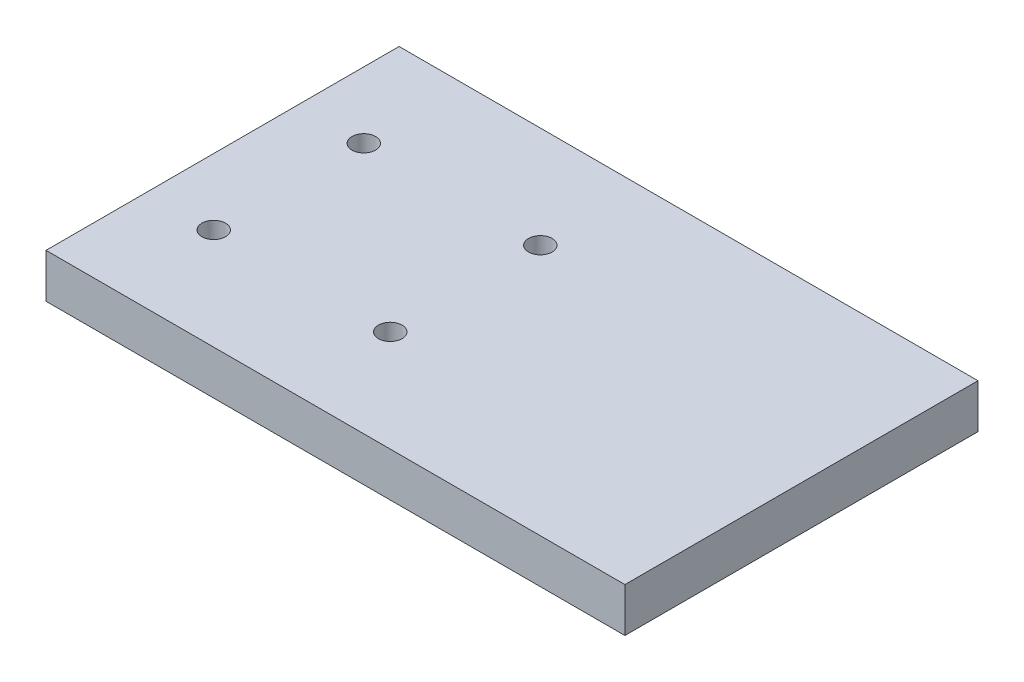
ISO-10303-21;
HEADER;
FILE_DESCRIPTION(('STEP AP214'),'2;1');
FILE_NAME('part.step','',(''),(''),'','','');
FILE_SCHEMA(('AUTOMOTIVE_DESIGN { 1 0 10303 214 1 1 1 1 }'));
ENDSEC;
DATA;
#1=APPLICATION_CONTEXT('core data for automotive mechanical design processes');
#2=APPLICATION_PROTOCOL_DEFINITION('international standard','automotive_design',2000,#1);
#3=PRODUCT_CONTEXT('',#1,'mechanical');
#4=PRODUCT('Part','Part','',(#3));
#5=PRODUCT_RELATED_PRODUCT_CATEGORY('part','',(#4));
#6=PRODUCT_DEFINITION_FORMATION('','',#4);
#7=PRODUCT_DEFINITION_CONTEXT('part definition',#1,'design');
#8=PRODUCT_DEFINITION('design','',#6,#7);
#9=PRODUCT_DEFINITION_SHAPE('','',#8);
#10=(LENGTH_UNIT() NAMED_UNIT(*) SI_UNIT(.MILLI.,.METRE.));
#11=(NAMED_UNIT(*) PLANE_ANGLE_UNIT() SI_UNIT($,.RADIAN.));
#12=(NAMED_UNIT(*) SI_UNIT($,.STERADIAN.) SOLID_ANGLE_UNIT());
#13=UNCERTAINTY_MEASURE_WITH_UNIT(LENGTH_MEASURE(1.E-05),#10,'distance_accuracy_value','');
#14=(GEOMETRIC_REPRESENTATION_CONTEXT(3) GLOBAL_UNCERTAINTY_ASSIGNED_CONTEXT((#13)) GLOBAL_UNIT_ASSIGNED_CONTEXT((#10,
#11,#12)) REPRESENTATION_CONTEXT('',''));
#15=CARTESIAN_POINT('',(0.,0.,0.));
#16=DIRECTION('',(0.,0.,1.));
#17=DIRECTION('',(1.,0.,0.));
#18=AXIS2_PLACEMENT_3D('',#15,#16,#17);
#19=CARTESIAN_POINT('',(0.,6.35,0.));
#20=DIRECTION('',(0.,-1.,0.));
#21=DIRECTION('',(0.,0.,-1.));
#22=AXIS2_PLACEMENT_3D('',#19,#20,#21);
#23=PLANE('',#22);
#24=CARTESIAN_POINT('',(-6.65836450012036,6.35,10.795));
#25=DIRECTION('',(0.,1.,0.));
#26=DIRECTION('',(0.,0.,1.));
#27=AXIS2_PLACEMENT_3D('',#24,#25,#26);
#28=CIRCLE('',#27,1.70053);
#29=CARTESIAN_POINT('',(-6.65836450012036,6.35,12.49553));
#30=VERTEX_POINT('',#29);
#31=EDGE_CURVE('E157',#30,#30,#28,.T.);
#32=ORIENTED_EDGE('',*,*,#31,.F.);
#33=EDGE_LOOP('',(#32));
#34=FACE_BOUND('',#33,.T.);
#35=CARTESIAN_POINT('',(-32.0583645001204,6.35,-10.795));
#36=DIRECTION('',(0.,1.,0.));
#37=DIRECTION('',(0.,0.,1.));
#38=AXIS2_PLACEMENT_3D('',#35,#36,#37);
#39=CIRCLE('',#38,1.70053);
#40=CARTESIAN_POINT('',(-32.0583645001204,6.35,-9.09447000000001));
#41=VERTEX_POINT('',#40);
#42=EDGE_CURVE('E99',#41,#41,#39,.T.);
#43=ORIENTED_EDGE('',*,*,#42,.F.);
#44=EDGE_LOOP('',(#43));
#45=FACE_BOUND('',#44,.T.);
#46=DIRECTION('',(-1.,0.,0.));
#47=VECTOR('',#46,1.);
#48=CARTESIAN_POINT('',(-41.5846345001203,6.35,-25.4));
#49=LINE('',#48,#47);
#50=CARTESIAN_POINT('',(41.7070454998797,6.35,-25.4));
#51=VERTEX_POINT('',#50);
#52=CARTESIAN_POINT('',(-41.5846345001203,6.35,-25.4));
#53=VERTEX_POINT('',#52);
#54=EDGE_CURVE('E50',#51,#53,#49,.T.);
#55=ORIENTED_EDGE('',*,*,#54,.T.);
#56=DIRECTION('',(0.,0.,1.));
#57=VECTOR('',#56,1.);
#58=CARTESIAN_POINT('',(-41.5846345001203,6.35,-25.4));
#59=LINE('',#58,#57);
#60=CARTESIAN_POINT('',(-41.5846345001203,6.35,25.4));
#61=VERTEX_POINT('',#60);
#62=EDGE_CURVE('E81',#53,#61,#59,.T.);
#63=ORIENTED_EDGE('',*,*,#62,.T.);
#64=DIRECTION('',(1.,0.,0.));
#65=VECTOR('',#64,1.);
#66=CARTESIAN_POINT('',(-41.5846345001203,6.35,25.4));
#67=LINE('',#66,#65);
#68=CARTESIAN_POINT('',(41.7070454998797,6.35,25.4));
#69=VERTEX_POINT('',#68);
#70=EDGE_CURVE('E85',#61,#69,#67,.T.);
#71=ORIENTED_EDGE('',*,*,#70,.T.);
#72=DIRECTION('',(0.,0.,-1.));
#73=VECTOR('',#72,1.);
#74=CARTESIAN_POINT('',(41.7070454998797,6.35,-25.4));
#75=LINE('',#74,#73);
#76=EDGE_CURVE('E92',#69,#51,#75,.T.);
#77=ORIENTED_EDGE('',*,*,#76,.T.);
#78=EDGE_LOOP('',(#55,#63,#71,#77));
#79=FACE_BOUND('',#78,.T.);
#80=CARTESIAN_POINT('',(-32.0583645001204,6.35,10.795));
#81=DIRECTION('',(0.,1.,0.));
#82=DIRECTION('',(0.,0.,1.));
#83=AXIS2_PLACEMENT_3D('',#80,#81,#82);
#84=CIRCLE('',#83,1.70053);
#85=CARTESIAN_POINT('',(-32.0583645001204,6.35,12.49553));
#86=VERTEX_POINT('',#85);
#87=EDGE_CURVE('E163',#86,#86,#84,.T.);
#88=ORIENTED_EDGE('',*,*,#87,.F.);
#89=EDGE_LOOP('',(#88));
#90=FACE_BOUND('',#89,.T.);
#91=CARTESIAN_POINT('',(-6.65836450012036,6.35,-10.795));
#92=DIRECTION('',(0.,1.,0.));
#93=DIRECTION('',(0.,0.,1.));
#94=AXIS2_PLACEMENT_3D('',#91,#92,#93);
#95=CIRCLE('',#94,1.70053);
#96=CARTESIAN_POINT('',(-6.65836450012036,6.35,-9.09447000000001));
#97=VERTEX_POINT('',#96);
#98=EDGE_CURVE('E148',#97,#97,#95,.T.);
#99=ORIENTED_EDGE('',*,*,#98,.F.);
#100=EDGE_LOOP('',(#99));
#101=FACE_BOUND('',#100,.T.);
#102=ADVANCED_FACE('F33',(#34,#45,#79,#90,#101),#23,.F.);
#103=CARTESIAN_POINT('',(0.,0.,0.));
#104=DIRECTION('',(0.,-1.,0.));
#105=DIRECTION('',(0.,0.,-1.));
#106=AXIS2_PLACEMENT_3D('',#103,#104,#105);
#107=PLANE('',#106);
#108=CARTESIAN_POINT('',(-6.65836450012036,0.,10.795));
#109=DIRECTION('',(0.,1.,0.));
#110=DIRECTION('',(0.,0.,1.));
#111=AXIS2_PLACEMENT_3D('',#108,#109,#110);
#112=CIRCLE('',#111,1.70053);
#113=CARTESIAN_POINT('',(-6.65836450012036,0.,12.49553));
#114=VERTEX_POINT('',#113);
#115=EDGE_CURVE('E154',#114,#114,#112,.T.);
#116=ORIENTED_EDGE('',*,*,#115,.T.);
#117=EDGE_LOOP('',(#116));
#118=FACE_BOUND('',#117,.T.);
#119=CARTESIAN_POINT('',(-32.0583645001204,0.,-10.795));
#120=DIRECTION('',(0.,1.,0.));
#121=DIRECTION('',(0.,0.,1.));
#122=AXIS2_PLACEMENT_3D('',#119,#120,#121);
#123=CIRCLE('',#122,1.70053);
#124=CARTESIAN_POINT('',(-32.0583645001204,0.,-9.09447000000001));
#125=VERTEX_POINT('',#124);
#126=EDGE_CURVE('E166',#125,#125,#123,.T.);
#127=ORIENTED_EDGE('',*,*,#126,.T.);
#128=EDGE_LOOP('',(#127));
#129=FACE_BOUND('',#128,.T.);
#130=DIRECTION('',(0.,0.,1.));
#131=VECTOR('',#130,1.);
#132=CARTESIAN_POINT('',(-41.5846345001203,0.,-25.4));
#133=LINE('',#132,#131);
#134=CARTESIAN_POINT('',(-41.5846345001203,0.,-25.4));
#135=VERTEX_POINT('',#134);
#136=CARTESIAN_POINT('',(-41.5846345001203,0.,25.4));
#137=VERTEX_POINT('',#136);
#138=EDGE_CURVE('E88',#135,#137,#133,.T.);
#139=ORIENTED_EDGE('',*,*,#138,.F.);
#140=DIRECTION('',(-1.,0.,0.));
#141=VECTOR('',#140,1.);
#142=CARTESIAN_POINT('',(-38.5357973161203,0.,-25.4));
#143=LINE('',#142,#141);
#144=CARTESIAN_POINT('',(41.7070454998797,0.,-25.4));
#145=VERTEX_POINT('',#144);
#146=EDGE_CURVE('E74',#145,#135,#143,.T.);
#147=ORIENTED_EDGE('',*,*,#146,.F.);
#148=DIRECTION('',(0.,0.,-1.));
#149=VECTOR('',#148,1.);
#150=CARTESIAN_POINT('',(41.7070454998797,0.,-25.4));
#151=LINE('',#150,#149);
#152=CARTESIAN_POINT('',(41.7070454998797,0.,25.4));
#153=VERTEX_POINT('',#152);
#154=EDGE_CURVE('E101',#153,#145,#151,.T.);
#155=ORIENTED_EDGE('',*,*,#154,.F.);
#156=DIRECTION('',(1.,0.,0.));
#157=VECTOR('',#156,1.);
#158=CARTESIAN_POINT('',(41.7070454998797,0.,25.4));
#159=LINE('',#158,#157);
#160=EDGE_CURVE('E67',#137,#153,#159,.T.);
#161=ORIENTED_EDGE('',*,*,#160,.F.);
#162=EDGE_LOOP('',(#139,#147,#155,#161));
#163=FACE_BOUND('',#162,.T.);
#164=CARTESIAN_POINT('',(-32.0583645001204,0.,10.795));
#165=DIRECTION('',(0.,1.,0.));
#166=DIRECTION('',(0.,0.,1.));
#167=AXIS2_PLACEMENT_3D('',#164,#165,#166);
#168=CIRCLE('',#167,1.70053);
#169=CARTESIAN_POINT('',(-32.0583645001204,0.,12.49553));
#170=VERTEX_POINT('',#169);
#171=EDGE_CURVE('E160',#170,#170,#168,.T.);
#172=ORIENTED_EDGE('',*,*,#171,.T.);
#173=EDGE_LOOP('',(#172));
#174=FACE_BOUND('',#173,.T.);
#175=CARTESIAN_POINT('',(-6.65836450012036,0.,-10.795));
#176=DIRECTION('',(0.,1.,0.));
#177=DIRECTION('',(0.,0.,1.));
#178=AXIS2_PLACEMENT_3D('',#175,#176,#177);
#179=CIRCLE('',#178,1.70053);
#180=CARTESIAN_POINT('',(-6.65836450012036,0.,-9.09447000000001));
#181=VERTEX_POINT('',#180);
#182=EDGE_CURVE('E151',#181,#181,#179,.T.);
#183=ORIENTED_EDGE('',*,*,#182,.T.);
#184=EDGE_LOOP('',(#183));
#185=FACE_BOUND('',#184,.T.);
#186=ADVANCED_FACE('F108',(#118,#129,#163,#174,#185),#107,.T.);
#187=CARTESIAN_POINT('',(-41.5846345001203,6.35,-25.4));
#188=DIRECTION('',(1.,0.,0.));
#189=DIRECTION('',(0.,0.,-1.));
#190=AXIS2_PLACEMENT_3D('',#187,#188,#189);
#191=PLANE('',#190);
#192=ORIENTED_EDGE('',*,*,#138,.T.);
#193=DIRECTION('',(0.,-1.,0.));
#194=VECTOR('',#193,1.);
#195=CARTESIAN_POINT('',(-41.5846345001203,6.35,25.4));
#196=LINE('',#195,#194);
#197=EDGE_CURVE('E42',#61,#137,#196,.T.);
#198=ORIENTED_EDGE('',*,*,#197,.F.);
#199=ORIENTED_EDGE('',*,*,#62,.F.);
#200=DIRECTION('',(0.,-1.,0.));
#201=VECTOR('',#200,1.);
#202=CARTESIAN_POINT('',(-41.5846345001203,6.35,-25.4));
#203=LINE('',#202,#201);
#204=EDGE_CURVE('E11',#53,#135,#203,.T.);
#205=ORIENTED_EDGE('',*,*,#204,.T.);
#206=EDGE_LOOP('',(#192,#198,#199,#205));
#207=FACE_BOUND('',#206,.T.);
#208=ADVANCED_FACE('F35',(#207),#191,.F.);
#209=CARTESIAN_POINT('',(41.7070454998797,6.35,25.4));
#210=DIRECTION('',(0.,0.,-1.));
#211=DIRECTION('',(-1.,0.,0.));
#212=AXIS2_PLACEMENT_3D('',#209,#210,#211);
#213=PLANE('',#212);
#214=ORIENTED_EDGE('',*,*,#160,.T.);
#215=DIRECTION('',(0.,-1.,0.));
#216=VECTOR('',#215,1.);
#217=CARTESIAN_POINT('',(41.7070454998797,6.35,25.4));
#218=LINE('',#217,#216);
#219=EDGE_CURVE('E89',#69,#153,#218,.T.);
#220=ORIENTED_EDGE('',*,*,#219,.F.);
#221=ORIENTED_EDGE('',*,*,#70,.F.);
#222=ORIENTED_EDGE('',*,*,#197,.T.);
#223=EDGE_LOOP('',(#214,#220,#221,#222));
#224=FACE_BOUND('',#223,.T.);
#225=ADVANCED_FACE('F90',(#224),#213,.F.);
#226=CARTESIAN_POINT('',(41.7070454998797,6.35,-25.4));
#227=DIRECTION('',(-1.,0.,0.));
#228=DIRECTION('',(0.,0.,1.));
#229=AXIS2_PLACEMENT_3D('',#226,#227,#228);
#230=PLANE('',#229);
#231=ORIENTED_EDGE('',*,*,#154,.T.);
#232=DIRECTION('',(0.,-1.,0.));
#233=VECTOR('',#232,1.);
#234=CARTESIAN_POINT('',(41.7070454998797,6.35,-25.4));
#235=LINE('',#234,#233);
#236=EDGE_CURVE('E94',#51,#145,#235,.T.);
#237=ORIENTED_EDGE('',*,*,#236,.F.);
#238=ORIENTED_EDGE('',*,*,#76,.F.);
#239=ORIENTED_EDGE('',*,*,#219,.T.);
#240=EDGE_LOOP('',(#231,#237,#238,#239));
#241=FACE_BOUND('',#240,.T.);
#242=ADVANCED_FACE('F106',(#241),#230,.F.);
#243=CARTESIAN_POINT('',(-38.5357973161203,6.35,-25.4));
#244=DIRECTION('',(0.,0.,1.));
#245=DIRECTION('',(1.,0.,0.));
#246=AXIS2_PLACEMENT_3D('',#243,#244,#245);
#247=PLANE('',#246);
#248=ORIENTED_EDGE('',*,*,#146,.T.);
#249=ORIENTED_EDGE('',*,*,#204,.F.);
#250=ORIENTED_EDGE('',*,*,#54,.F.);
#251=ORIENTED_EDGE('',*,*,#236,.T.);
#252=EDGE_LOOP('',(#248,#249,#250,#251));
#253=FACE_BOUND('',#252,.T.);
#254=ADVANCED_FACE('F110',(#253),#247,.F.);
#255=CARTESIAN_POINT('',(-32.0583645001204,6.35,-10.795));
#256=DIRECTION('',(0.,-1.,0.));
#257=DIRECTION('',(0.,0.,-1.));
#258=AXIS2_PLACEMENT_3D('',#255,#256,#257);
#259=CYLINDRICAL_SURFACE('',#258,1.70053);
#260=ORIENTED_EDGE('',*,*,#42,.T.);
#261=EDGE_LOOP('',(#260));
#262=FACE_BOUND('',#261,.T.);
#263=ORIENTED_EDGE('',*,*,#126,.F.);
#264=EDGE_LOOP('',(#263));
#265=FACE_BOUND('',#264,.T.);
#266=ADVANCED_FACE('F112',(#262,#265),#259,.F.);
#267=CARTESIAN_POINT('',(-32.0583645001204,6.35,10.795));
#268=DIRECTION('',(0.,-1.,0.));
#269=DIRECTION('',(0.,0.,-1.));
#270=AXIS2_PLACEMENT_3D('',#267,#268,#269);
#271=CYLINDRICAL_SURFACE('',#270,1.70053);
#272=ORIENTED_EDGE('',*,*,#87,.T.);
#273=EDGE_LOOP('',(#272));
#274=FACE_BOUND('',#273,.T.);
#275=ORIENTED_EDGE('',*,*,#171,.F.);
#276=EDGE_LOOP('',(#275));
#277=FACE_BOUND('',#276,.T.);
#278=ADVANCED_FACE('F118',(#274,#277),#271,.F.);
#279=CARTESIAN_POINT('',(-6.65836450012036,6.35,10.795));
#280=DIRECTION('',(0.,-1.,0.));
#281=DIRECTION('',(0.,0.,-1.));
#282=AXIS2_PLACEMENT_3D('',#279,#280,#281);
#283=CYLINDRICAL_SURFACE('',#282,1.70053);
#284=ORIENTED_EDGE('',*,*,#31,.T.);
#285=EDGE_LOOP('',(#284));
#286=FACE_BOUND('',#285,.T.);
#287=ORIENTED_EDGE('',*,*,#115,.F.);
#288=EDGE_LOOP('',(#287));
#289=FACE_BOUND('',#288,.T.);
#290=ADVANCED_FACE('F135',(#286,#289),#283,.F.);
#291=CARTESIAN_POINT('',(-6.65836450012036,6.35,-10.795));
#292=DIRECTION('',(0.,-1.,0.));
#293=DIRECTION('',(0.,0.,-1.));
#294=AXIS2_PLACEMENT_3D('',#291,#292,#293);
#295=CYLINDRICAL_SURFACE('',#294,1.70053);
#296=ORIENTED_EDGE('',*,*,#98,.T.);
#297=EDGE_LOOP('',(#296));
#298=FACE_BOUND('',#297,.T.);
#299=ORIENTED_EDGE('',*,*,#182,.F.);
#300=EDGE_LOOP('',(#299));
#301=FACE_BOUND('',#300,.T.);
#302=ADVANCED_FACE('F139',(#298,#301),#295,.F.);
#303=CLOSED_SHELL('',(#102,#186,#208,#225,#242,#254,#266,#278,#290,#302));
#304=MANIFOLD_SOLID_BREP('B2',#303);
#305=ADVANCED_BREP_SHAPE_REPRESENTATION('',(#18,#304),#14);
#306=SHAPE_DEFINITION_REPRESENTATION(#9,#305);
ENDSEC;
END-ISO-10303-21;
